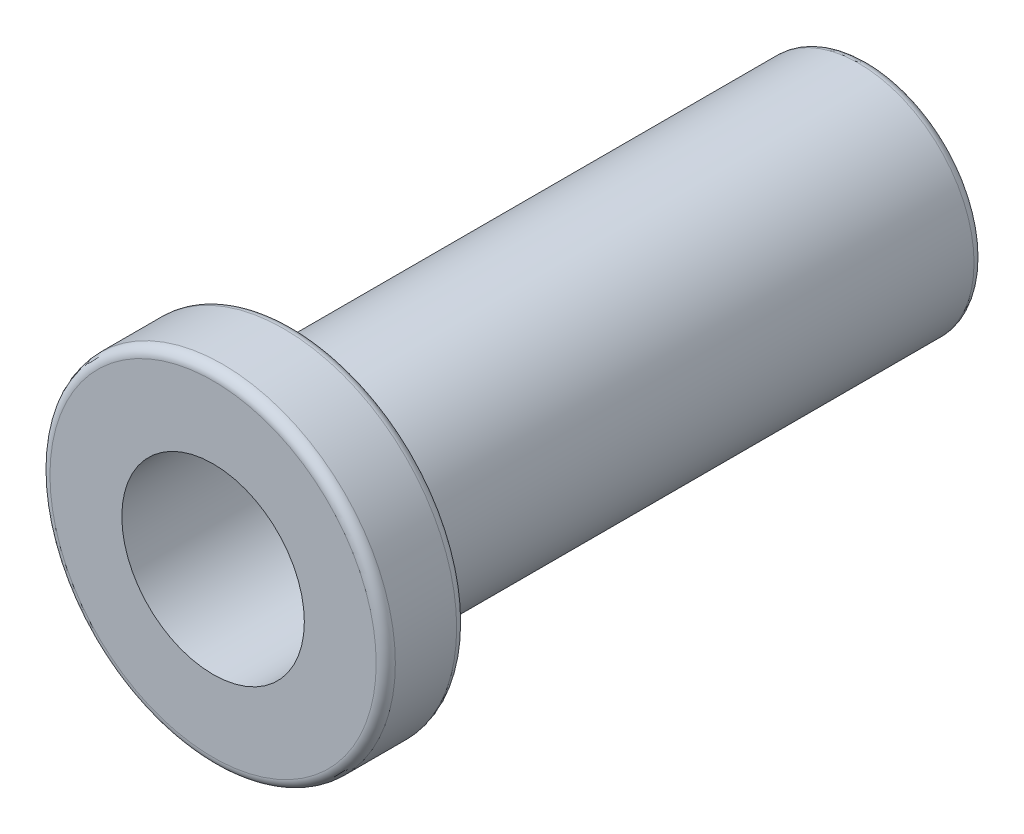
ISO-10303-21;
HEADER;
FILE_DESCRIPTION(('STEP AP214'),'2;1');
FILE_NAME('part.step','',(''),(''),'','','');
FILE_SCHEMA(('AUTOMOTIVE_DESIGN { 1 0 10303 214 1 1 1 1 }'));
ENDSEC;
DATA;
#1=APPLICATION_CONTEXT('core data for automotive mechanical design processes');
#2=APPLICATION_PROTOCOL_DEFINITION('international standard','automotive_design',2000,#1);
#3=PRODUCT_CONTEXT('',#1,'mechanical');
#4=PRODUCT('Part','Part','',(#3));
#5=PRODUCT_RELATED_PRODUCT_CATEGORY('part','',(#4));
#6=PRODUCT_DEFINITION_FORMATION('','',#4);
#7=PRODUCT_DEFINITION_CONTEXT('part definition',#1,'design');
#8=PRODUCT_DEFINITION('design','',#6,#7);
#9=PRODUCT_DEFINITION_SHAPE('','',#8);
#10=(LENGTH_UNIT() NAMED_UNIT(*) SI_UNIT(.MILLI.,.METRE.));
#11=(NAMED_UNIT(*) PLANE_ANGLE_UNIT() SI_UNIT($,.RADIAN.));
#12=(NAMED_UNIT(*) SI_UNIT($,.STERADIAN.) SOLID_ANGLE_UNIT());
#13=UNCERTAINTY_MEASURE_WITH_UNIT(LENGTH_MEASURE(1.E-05),#10,'distance_accuracy_value','');
#14=(GEOMETRIC_REPRESENTATION_CONTEXT(3) GLOBAL_UNCERTAINTY_ASSIGNED_CONTEXT((#13)) GLOBAL_UNIT_ASSIGNED_CONTEXT((#10,
#11,#12)) REPRESENTATION_CONTEXT('',''));
#15=CARTESIAN_POINT('',(0.,0.,0.));
#16=DIRECTION('',(0.,0.,1.));
#17=DIRECTION('',(1.,0.,0.));
#18=AXIS2_PLACEMENT_3D('',#15,#16,#17);
#19=CARTESIAN_POINT('',(70.7953340405663,51.2582555896555,-30.4045513169154));
#20=DIRECTION('',(0.,0.,1.));
#21=DIRECTION('',(0.999999999999996,0.,0.));
#22=AXIS2_PLACEMENT_3D('',#19,#20,#21);
#23=CYLINDRICAL_SURFACE('',#22,6.01250000000001);
#24=CARTESIAN_POINT('',(70.7953340405663,51.2582555896555,-29.9045513169154));
#25=DIRECTION('',(0.,0.,1.));
#26=DIRECTION('',(0.999999999999996,0.,0.));
#27=AXIS2_PLACEMENT_3D('',#24,#25,#26);
#28=CIRCLE('',#27,6.01250000000001);
#29=CARTESIAN_POINT('',(76.8078340405662,51.2582555896555,-29.9045513169154));
#30=VERTEX_POINT('',#29);
#31=EDGE_CURVE('E53',#30,#30,#28,.T.);
#32=ORIENTED_EDGE('',*,*,#31,.T.);
#33=EDGE_LOOP('',(#32));
#34=FACE_BOUND('',#33,.T.);
#35=CARTESIAN_POINT('',(70.7953340405663,51.2582555896556,-0.404551316915414));
#36=DIRECTION('',(0.,0.,1.));
#37=DIRECTION('',(0.999999999999996,0.,0.));
#38=AXIS2_PLACEMENT_3D('',#35,#36,#37);
#39=CIRCLE('',#38,6.01250000000001);
#40=CARTESIAN_POINT('',(76.8078340405663,51.2582555896556,-0.404551316915393));
#41=VERTEX_POINT('',#40);
#42=EDGE_CURVE('E62',#41,#41,#39,.T.);
#43=ORIENTED_EDGE('',*,*,#42,.F.);
#44=EDGE_LOOP('',(#43));
#45=FACE_BOUND('',#44,.T.);
#46=ADVANCED_FACE('F30',(#34,#45),#23,.T.);
#47=CARTESIAN_POINT('',(70.7953340405663,51.2582555896555,-30.4045513169154));
#48=DIRECTION('',(0.,0.,1.));
#49=DIRECTION('',(0.999999999999996,0.,0.));
#50=AXIS2_PLACEMENT_3D('',#47,#48,#49);
#51=PLANE('',#50);
#52=CARTESIAN_POINT('',(70.7953340405663,51.2582555896555,-30.4045513169154));
#53=DIRECTION('',(0.,0.,1.));
#54=DIRECTION('',(0.999999999999996,0.,0.));
#55=AXIS2_PLACEMENT_3D('',#52,#53,#54);
#56=CIRCLE('',#55,5.51250000000001);
#57=CARTESIAN_POINT('',(76.3078340405663,51.2582555896555,-30.4045513169154));
#58=VERTEX_POINT('',#57);
#59=EDGE_CURVE('E50',#58,#58,#56,.F.);
#60=ORIENTED_EDGE('',*,*,#59,.T.);
#61=EDGE_LOOP('',(#60));
#62=FACE_BOUND('',#61,.T.);
#63=CARTESIAN_POINT('',(70.7953340405663,51.2582555896555,-30.4045513169154));
#64=DIRECTION('',(0.,0.,1.));
#65=DIRECTION('',(0.999999999999996,0.,0.));
#66=AXIS2_PLACEMENT_3D('',#63,#64,#65);
#67=CIRCLE('',#66,4.7625);
#68=CARTESIAN_POINT('',(75.5578340405663,51.2582555896555,-30.4045513169154));
#69=VERTEX_POINT('',#68);
#70=EDGE_CURVE('E56',#69,#69,#67,.T.);
#71=ORIENTED_EDGE('',*,*,#70,.T.);
#72=EDGE_LOOP('',(#71));
#73=FACE_BOUND('',#72,.T.);
#74=ADVANCED_FACE('F69',(#62,#73),#51,.F.);
#75=CARTESIAN_POINT('',(70.7953340405663,51.2582555896555,-30.4045513169154));
#76=DIRECTION('',(0.,0.,1.));
#77=DIRECTION('',(0.999999999999996,0.,0.));
#78=AXIS2_PLACEMENT_3D('',#75,#76,#77);
#79=CYLINDRICAL_SURFACE('',#78,4.7625);
#80=ORIENTED_EDGE('',*,*,#70,.F.);
#81=EDGE_LOOP('',(#80));
#82=FACE_BOUND('',#81,.T.);
#83=CARTESIAN_POINT('',(70.7953340405663,51.2582555896556,3.7954486830846));
#84=DIRECTION('',(0.,0.,1.));
#85=DIRECTION('',(0.999999999999996,0.,0.));
#86=AXIS2_PLACEMENT_3D('',#83,#84,#85);
#87=CIRCLE('',#86,4.7625);
#88=CARTESIAN_POINT('',(75.5578340405663,51.2582555896556,3.79544868308461));
#89=VERTEX_POINT('',#88);
#90=EDGE_CURVE('E59',#89,#89,#87,.T.);
#91=ORIENTED_EDGE('',*,*,#90,.T.);
#92=EDGE_LOOP('',(#91));
#93=FACE_BOUND('',#92,.T.);
#94=ADVANCED_FACE('F75',(#82,#93),#79,.F.);
#95=CARTESIAN_POINT('',(70.7953340405663,51.2582555896556,3.7954486830846));
#96=DIRECTION('',(0.,0.,1.));
#97=DIRECTION('',(0.999999999999996,0.,0.));
#98=AXIS2_PLACEMENT_3D('',#95,#96,#97);
#99=PLANE('',#98);
#100=CARTESIAN_POINT('',(70.7953340405663,51.2582555896556,3.7954486830846));
#101=DIRECTION('',(0.,0.,1.));
#102=DIRECTION('',(0.999999999999996,0.,0.));
#103=AXIS2_PLACEMENT_3D('',#100,#101,#102);
#104=CIRCLE('',#103,8.51249999999999);
#105=CARTESIAN_POINT('',(79.3078340405663,51.2582555896556,3.79544868308462));
#106=VERTEX_POINT('',#105);
#107=EDGE_CURVE('E45',#106,#106,#104,.T.);
#108=ORIENTED_EDGE('',*,*,#107,.T.);
#109=EDGE_LOOP('',(#108));
#110=FACE_BOUND('',#109,.T.);
#111=ORIENTED_EDGE('',*,*,#90,.F.);
#112=EDGE_LOOP('',(#111));
#113=FACE_BOUND('',#112,.T.);
#114=ADVANCED_FACE('F94',(#110,#113),#99,.T.);
#115=CARTESIAN_POINT('',(70.7953340405663,51.2582555896556,-0.404551316915414));
#116=DIRECTION('',(0.,0.,1.));
#117=DIRECTION('',(0.999999999999996,0.,0.));
#118=AXIS2_PLACEMENT_3D('',#115,#116,#117);
#119=PLANE('',#118);
#120=CARTESIAN_POINT('',(70.7953340405663,51.2582555896556,-0.404551316915414));
#121=DIRECTION('',(0.,0.,1.));
#122=DIRECTION('',(0.999999999999996,0.,0.));
#123=AXIS2_PLACEMENT_3D('',#120,#121,#122);
#124=CIRCLE('',#123,8.51249999999999);
#125=CARTESIAN_POINT('',(79.3078340405662,51.2582555896557,-0.404551316915385));
#126=VERTEX_POINT('',#125);
#127=EDGE_CURVE('E10',#126,#126,#124,.F.);
#128=ORIENTED_EDGE('',*,*,#127,.T.);
#129=EDGE_LOOP('',(#128));
#130=FACE_BOUND('',#129,.T.);
#131=ORIENTED_EDGE('',*,*,#42,.T.);
#132=EDGE_LOOP('',(#131));
#133=FACE_BOUND('',#132,.T.);
#134=ADVANCED_FACE('F66',(#130,#133),#119,.F.);
#135=CARTESIAN_POINT('',(70.7953340405663,51.2582555896556,3.7954486830846));
#136=DIRECTION('',(0.,0.,-1.));
#137=DIRECTION('',(-0.999999999999996,0.,0.));
#138=AXIS2_PLACEMENT_3D('',#135,#136,#137);
#139=CYLINDRICAL_SURFACE('',#138,9.01249999999999);
#140=CARTESIAN_POINT('',(70.7953340405665,51.2582555896556,3.2954486830846));
#141=DIRECTION('',(0.,0.,1.));
#142=DIRECTION('',(0.999999999999996,0.,0.));
#143=AXIS2_PLACEMENT_3D('',#140,#141,#142);
#144=CIRCLE('',#143,9.01249999999999);
#145=CARTESIAN_POINT('',(79.8078340405664,51.2582555896556,3.29544868308463));
#146=VERTEX_POINT('',#145);
#147=EDGE_CURVE('E37',#146,#146,#144,.F.);
#148=ORIENTED_EDGE('',*,*,#147,.T.);
#149=EDGE_LOOP('',(#148));
#150=FACE_BOUND('',#149,.T.);
#151=CARTESIAN_POINT('',(70.7953340405665,51.2582555896556,0.0954486830845869));
#152=DIRECTION('',(0.,0.,1.));
#153=DIRECTION('',(0.999999999999996,0.,0.));
#154=AXIS2_PLACEMENT_3D('',#151,#152,#153);
#155=CIRCLE('',#154,9.01249999999999);
#156=CARTESIAN_POINT('',(79.8078340405664,51.2582555896557,0.0954486830846174));
#157=VERTEX_POINT('',#156);
#158=EDGE_CURVE('E41',#157,#157,#155,.T.);
#159=ORIENTED_EDGE('',*,*,#158,.T.);
#160=EDGE_LOOP('',(#159));
#161=FACE_BOUND('',#160,.T.);
#162=ADVANCED_FACE('F83',(#150,#161),#139,.T.);
#163=CARTESIAN_POINT('',(70.7953340405663,51.2582555896555,-29.9045513169154));
#164=DIRECTION('',(0.,0.,1.));
#165=DIRECTION('',(0.999999999999996,0.,0.));
#166=AXIS2_PLACEMENT_3D('',#163,#164,#165);
#167=TOROIDAL_SURFACE('',#166,5.51250000000001,0.5);
#168=ORIENTED_EDGE('',*,*,#59,.F.);
#169=EDGE_LOOP('',(#168));
#170=FACE_BOUND('',#169,.T.);
#171=ORIENTED_EDGE('',*,*,#31,.F.);
#172=EDGE_LOOP('',(#171));
#173=FACE_BOUND('',#172,.T.);
#174=ADVANCED_FACE('F80',(#170,#173),#167,.T.);
#175=CARTESIAN_POINT('',(70.7953340405665,51.2582555896556,3.2954486830846));
#176=DIRECTION('',(0.,0.,1.));
#177=DIRECTION('',(0.999999999999996,0.,0.));
#178=AXIS2_PLACEMENT_3D('',#175,#176,#177);
#179=TOROIDAL_SURFACE('',#178,8.51249999999999,0.5);
#180=ORIENTED_EDGE('',*,*,#147,.F.);
#181=EDGE_LOOP('',(#180));
#182=FACE_BOUND('',#181,.T.);
#183=ORIENTED_EDGE('',*,*,#107,.F.);
#184=EDGE_LOOP('',(#183));
#185=FACE_BOUND('',#184,.T.);
#186=ADVANCED_FACE('F82',(#182,#185),#179,.T.);
#187=CARTESIAN_POINT('',(70.7953340405665,51.2582555896556,0.0954486830845869));
#188=DIRECTION('',(0.,0.,1.));
#189=DIRECTION('',(0.999999999999996,0.,0.));
#190=AXIS2_PLACEMENT_3D('',#187,#188,#189);
#191=TOROIDAL_SURFACE('',#190,8.51249999999999,0.5);
#192=ORIENTED_EDGE('',*,*,#127,.F.);
#193=EDGE_LOOP('',(#192));
#194=FACE_BOUND('',#193,.T.);
#195=ORIENTED_EDGE('',*,*,#158,.F.);
#196=EDGE_LOOP('',(#195));
#197=FACE_BOUND('',#196,.T.);
#198=ADVANCED_FACE('F32',(#194,#197),#191,.T.);
#199=CLOSED_SHELL('',(#46,#74,#94,#114,#134,#162,#174,#186,#198));
#200=MANIFOLD_SOLID_BREP('B2',#199);
#201=ADVANCED_BREP_SHAPE_REPRESENTATION('',(#18,#200),#14);
#202=SHAPE_DEFINITION_REPRESENTATION(#9,#201);
ENDSEC;
END-ISO-10303-21;
